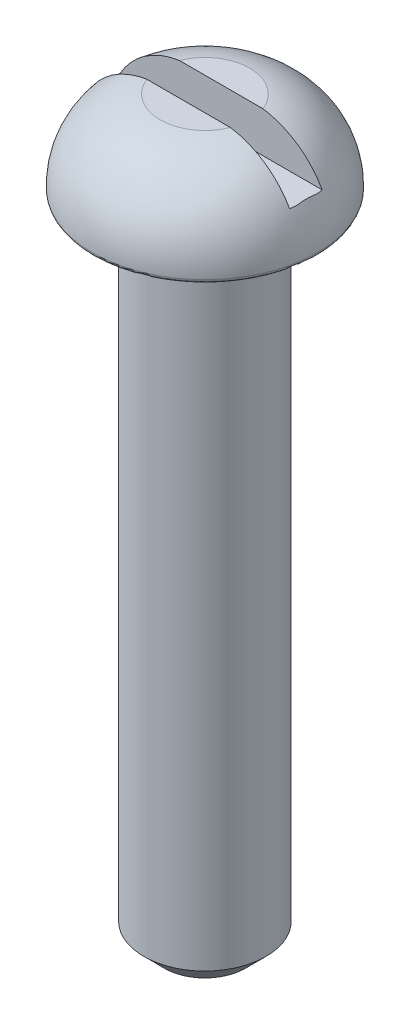
ISO-10303-21;
HEADER;
FILE_DESCRIPTION(('STEP AP214'),'2;1');
FILE_NAME('part.step','',(''),(''),'','','');
FILE_SCHEMA(('AUTOMOTIVE_DESIGN { 1 0 10303 214 1 1 1 1 }'));
ENDSEC;
DATA;
#1=APPLICATION_CONTEXT('core data for automotive mechanical design processes');
#2=APPLICATION_PROTOCOL_DEFINITION('international standard','automotive_design',2000,#1);
#3=PRODUCT_CONTEXT('',#1,'mechanical');
#4=PRODUCT('Part','Part','',(#3));
#5=PRODUCT_RELATED_PRODUCT_CATEGORY('part','',(#4));
#6=PRODUCT_DEFINITION_FORMATION('','',#4);
#7=PRODUCT_DEFINITION_CONTEXT('part definition',#1,'design');
#8=PRODUCT_DEFINITION('design','',#6,#7);
#9=PRODUCT_DEFINITION_SHAPE('','',#8);
#10=(LENGTH_UNIT() NAMED_UNIT(*) SI_UNIT(.MILLI.,.METRE.));
#11=(NAMED_UNIT(*) PLANE_ANGLE_UNIT() SI_UNIT($,.RADIAN.));
#12=(NAMED_UNIT(*) SI_UNIT($,.STERADIAN.) SOLID_ANGLE_UNIT());
#13=UNCERTAINTY_MEASURE_WITH_UNIT(LENGTH_MEASURE(1.E-05),#10,'distance_accuracy_value','');
#14=(GEOMETRIC_REPRESENTATION_CONTEXT(3) GLOBAL_UNCERTAINTY_ASSIGNED_CONTEXT((#13)) GLOBAL_UNIT_ASSIGNED_CONTEXT((#10,
#11,#12)) REPRESENTATION_CONTEXT('',''));
#15=CARTESIAN_POINT('',(0.,0.,0.));
#16=DIRECTION('',(0.,0.,1.));
#17=DIRECTION('',(1.,0.,0.));
#18=AXIS2_PLACEMENT_3D('',#15,#16,#17);
#19=CARTESIAN_POINT('',(0.,18.1,0.));
#20=DIRECTION('',(0.,1.,0.));
#21=DIRECTION('',(0.,0.,1.));
#22=AXIS2_PLACEMENT_3D('',#19,#20,#21);
#23=PLANE('',#22);
#24=DIRECTION('',(-1.,0.,0.));
#25=VECTOR('',#24,1.);
#26=CARTESIAN_POINT('',(-2.5,18.1,-0.4));
#27=LINE('',#26,#25);
#28=CARTESIAN_POINT('',(1.02469507659597,18.1,-0.4));
#29=VERTEX_POINT('',#28);
#30=CARTESIAN_POINT('',(-1.02469507659597,18.1,-0.4));
#31=VERTEX_POINT('',#30);
#32=EDGE_CURVE('E95',#29,#31,#27,.T.);
#33=ORIENTED_EDGE('',*,*,#32,.F.);
#34=CARTESIAN_POINT('',(0.,18.1,0.));
#35=DIRECTION('',(0.,-1.,0.));
#36=DIRECTION('',(0.,0.,-1.));
#37=AXIS2_PLACEMENT_3D('',#34,#35,#36);
#38=CIRCLE('',#37,1.1);
#39=EDGE_CURVE('E101',#31,#29,#38,.T.);
#40=ORIENTED_EDGE('',*,*,#39,.F.);
#41=EDGE_LOOP('',(#33,#40));
#42=FACE_BOUND('',#41,.T.);
#43=ADVANCED_FACE('F29',(#42),#23,.T.);
#44=CARTESIAN_POINT('',(1.,0.,0.));
#45=DIRECTION('',(0.,-1.,0.));
#46=DIRECTION('',(0.,0.,-1.));
#47=AXIS2_PLACEMENT_3D('',#44,#45,#46);
#48=PLANE('',#47);
#49=CARTESIAN_POINT('',(0.,0.,0.));
#50=DIRECTION('',(0.,-1.,0.));
#51=DIRECTION('',(0.,0.,-1.));
#52=AXIS2_PLACEMENT_3D('',#49,#50,#51);
#53=CIRCLE('',#52,1.);
#54=CARTESIAN_POINT('',(0.,0.,-1.));
#55=VERTEX_POINT('',#54);
#56=EDGE_CURVE('E223',#55,#55,#53,.T.);
#57=ORIENTED_EDGE('',*,*,#56,.T.);
#58=EDGE_LOOP('',(#57));
#59=FACE_BOUND('',#58,.T.);
#60=ADVANCED_FACE('F31',(#59),#48,.T.);
#61=DIRECTION('',(1.,0.,0.));
#62=VECTOR('',#61,1.);
#63=CARTESIAN_POINT('',(-2.5,18.1,0.4));
#64=LINE('',#63,#62);
#65=CARTESIAN_POINT('',(-1.02469507659597,18.1,0.4));
#66=VERTEX_POINT('',#65);
#67=CARTESIAN_POINT('',(1.02469507659597,18.1,0.4));
#68=VERTEX_POINT('',#67);
#69=EDGE_CURVE('E87',#66,#68,#64,.T.);
#70=ORIENTED_EDGE('',*,*,#69,.F.);
#71=EDGE_CURVE('E94',#68,#66,#38,.T.);
#72=ORIENTED_EDGE('',*,*,#71,.F.);
#73=EDGE_LOOP('',(#70,#72));
#74=FACE_BOUND('',#73,.T.);
#75=ADVANCED_FACE('F93',(#74),#23,.T.);
#76=CARTESIAN_POINT('',(0.,16.150099776341,0.));
#77=DIRECTION('',(0.,-1.,0.));
#78=DIRECTION('',(0.,0.,-1.));
#79=AXIS2_PLACEMENT_3D('',#76,#77,#78);
#80=DEGENERATE_TOROIDAL_SURFACE('',#79,0.779672442615769,1.97603659537098,.T.);
#81=CARTESIAN_POINT('',(0.,18.0893185526949,0.4));
#82=CARTESIAN_POINT('',(0.0336322301279484,18.0893205716001,0.4));
#83=CARTESIAN_POINT('',(0.0672648143564295,18.0901784468217,0.4));
#84=CARTESIAN_POINT('',(0.134486048973815,18.0932787408374,0.4));
#85=CARTESIAN_POINT('',(0.168074638300507,18.0955223279096,0.4));
#86=CARTESIAN_POINT('',(0.235341692539278,18.100675588183,0.4));
#87=CARTESIAN_POINT('',(0.269019918116885,18.1035880994358,0.4));
#88=CARTESIAN_POINT('',(0.336378018840054,18.1093648088338,0.4));
#89=CARTESIAN_POINT('',(0.370057893639487,18.1122290108159,0.4));
#90=CARTESIAN_POINT('',(0.437877287244912,18.1174111816535,0.4));
#91=CARTESIAN_POINT('',(0.472017389468459,18.1197220409397,0.4));
#92=CARTESIAN_POINT('',(0.540348220697959,18.1233824621022,0.4));
#93=CARTESIAN_POINT('',(0.574538947867759,18.124732058027,0.4));
#94=CARTESIAN_POINT('',(0.677147719963299,18.1269491128557,0.4));
#95=CARTESIAN_POINT('',(0.745623445649574,18.1259868039846,0.4));
#96=CARTESIAN_POINT('',(0.881972396232885,18.1181001103437,0.4));
#97=CARTESIAN_POINT('',(0.949846939653067,18.1112000935624,0.4));
#98=CARTESIAN_POINT('',(1.08464932382839,18.091052747799,0.4));
#99=CARTESIAN_POINT('',(1.1515770535867,18.0778046808679,0.4));
#100=CARTESIAN_POINT('',(1.32743905883569,18.0338998713499,0.4));
#101=CARTESIAN_POINT('',(1.43501246700903,17.9975241731368,0.4));
#102=CARTESIAN_POINT('',(1.64277375092832,17.9071409643015,0.4));
#103=CARTESIAN_POINT('',(1.74294278143891,17.8530902425877,0.4));
#104=CARTESIAN_POINT('',(1.93265776354999,17.7286817859467,0.4));
#105=CARTESIAN_POINT('',(2.02220009208707,17.6583185134356,0.4));
#106=CARTESIAN_POINT('',(2.18779655682164,17.5033275008754,0.4));
#107=CARTESIAN_POINT('',(2.26386325268286,17.4187131882393,0.4));
#108=CARTESIAN_POINT('',(2.39887936251544,17.2395132914902,0.4));
#109=CARTESIAN_POINT('',(2.4581485407167,17.1451684721683,0.4));
#110=CARTESIAN_POINT('',(2.55988756159558,16.9477855070151,0.4));
#111=CARTESIAN_POINT('',(2.60235359515437,16.8447453964566,0.4));
#112=CARTESIAN_POINT('',(2.66896720325158,16.6337422855212,0.4));
#113=CARTESIAN_POINT('',(2.69324730817994,16.5258211017661,0.4));
#114=CARTESIAN_POINT('',(2.72329499940504,16.3074482378214,0.4));
#115=CARTESIAN_POINT('',(2.72906565960174,16.1969969808749,0.4));
#116=CARTESIAN_POINT('',(2.72194370625238,15.9769623688357,0.4));
#117=CARTESIAN_POINT('',(2.70909546504866,15.8673775740258,0.4));
#118=CARTESIAN_POINT('',(2.6651805408064,15.6518857114062,0.4));
#119=CARTESIAN_POINT('',(2.63410816106256,15.5459798045542,0.4));
#120=CARTESIAN_POINT('',(2.55461964830541,15.3408306457122,0.4));
#121=CARTESIAN_POINT('',(2.50619477197843,15.2415907824946,0.4));
#122=CARTESIAN_POINT('',(2.39346155608861,15.052730884082,0.4));
#123=CARTESIAN_POINT('',(2.32917055267637,14.9631005013886,0.4));
#124=CARTESIAN_POINT('',(2.18644835327305,14.7957164743583,0.4));
#125=CARTESIAN_POINT('',(2.10799740164991,14.7179797073024,0.4));
#126=CARTESIAN_POINT('',(1.93891521729073,14.5763707060294,0.4));
#127=CARTESIAN_POINT('',(1.84824228313099,14.5125479889316,0.4));
#128=CARTESIAN_POINT('',(1.70483704950053,14.4284535397504,0.4));
#129=CARTESIAN_POINT('',(1.65548996211767,14.4022428223578,0.4));
#130=CARTESIAN_POINT('',(1.55478898942816,14.3540199909275,0.4));
#131=CARTESIAN_POINT('',(1.50343572310355,14.332006593994,0.4));
#132=CARTESIAN_POINT('',(1.39961052954735,14.2924848989193,0.4));
#133=CARTESIAN_POINT('',(1.34715470355699,14.2749341704783,0.4));
#134=CARTESIAN_POINT('',(1.2409666890078,14.244087442157,0.4));
#135=CARTESIAN_POINT('',(1.18723349557357,14.2307949196762,0.4));
#136=CARTESIAN_POINT('',(1.06403178522894,14.205409251435,0.4));
#137=CARTESIAN_POINT('',(0.994285023188455,14.1946421646372,0.4));
#138=CARTESIAN_POINT('',(0.889221117660135,14.1834683145864,0.4));
#139=CARTESIAN_POINT('',(0.854144078017123,14.1805733737856,0.4));
#140=CARTESIAN_POINT('',(0.783890511350756,14.1763542743213,0.4));
#141=CARTESIAN_POINT('',(0.748713977069496,14.1750302333769,0.4));
#142=CARTESIAN_POINT('',(0.677638959238733,14.1738276664905,0.4));
#143=CARTESIAN_POINT('',(0.641740038461007,14.1739784290901,0.4));
#144=CARTESIAN_POINT('',(0.569980696305394,14.1756063795703,0.4));
#145=CARTESIAN_POINT('',(0.534120269672281,14.1770833545146,0.4));
#146=CARTESIAN_POINT('',(0.462484408653173,14.1810718468225,0.4));
#147=CARTESIAN_POINT('',(0.426708933647391,14.1835826767192,0.4));
#148=CARTESIAN_POINT('',(0.355202454218452,14.1891910628304,0.4));
#149=CARTESIAN_POINT('',(0.319471456309069,14.1922886966696,0.4));
#150=CARTESIAN_POINT('',(0.242092989679392,14.1989153704634,0.4));
#151=CARTESIAN_POINT('',(0.200444216725471,14.202431044494,0.4));
#152=CARTESIAN_POINT('',(0.117048492487825,14.2079387604799,0.4));
#153=CARTESIAN_POINT('',(0.0753016013203199,14.209931570048,0.4));
#154=CARTESIAN_POINT('',(-0.00826329739641611,14.2112825106585,0.4));
#155=CARTESIAN_POINT('',(-0.0500813291633944,14.2106394017257,0.4));
#156=CARTESIAN_POINT('',(-0.133639653626829,14.207103381295,0.4));
#157=CARTESIAN_POINT('',(-0.175379845783751,14.2042084942557,0.4));
#158=CARTESIAN_POINT('',(-0.258750304049306,14.1975943400043,0.4));
#159=CARTESIAN_POINT('',(-0.300380631753085,14.1938757412807,0.4));
#160=CARTESIAN_POINT('',(-0.383666399543725,14.186876174696,0.4));
#161=CARTESIAN_POINT('',(-0.425321824593241,14.1835950450587,0.4));
#162=CARTESIAN_POINT('',(-0.508683231706619,14.1782963358118,0.4));
#163=CARTESIAN_POINT('',(-0.550389134860414,14.1762776249953,0.4));
#164=CARTESIAN_POINT('',(-0.633847536707261,14.1739944667312,0.4));
#165=CARTESIAN_POINT('',(-0.675600033238177,14.1737299410121,0.4));
#166=CARTESIAN_POINT('',(-0.798279554043574,14.1759998570305,0.4));
#167=CARTESIAN_POINT('',(-0.879185473529252,14.1813950893823,0.4));
#168=CARTESIAN_POINT('',(-1.04009545442698,14.2010893630931,0.4));
#169=CARTESIAN_POINT('',(-1.12009731292904,14.2154067359856,0.4));
#170=CARTESIAN_POINT('',(-1.27744036603241,14.2531371767776,0.4));
#171=CARTESIAN_POINT('',(-1.35479443169436,14.2764963080499,0.4));
#172=CARTESIAN_POINT('',(-1.50607354050183,14.3322003727284,0.4));
#173=CARTESIAN_POINT('',(-1.58000406828918,14.3645303092733,0.4));
#174=CARTESIAN_POINT('',(-1.70066637437027,14.4262016445704,0.4));
#175=CARTESIAN_POINT('',(-1.74858977096696,14.4532405563336,0.4));
#176=CARTESIAN_POINT('',(-1.84204738578045,14.5111970567725,0.4));
#177=CARTESIAN_POINT('',(-1.88758126390451,14.5421151954546,0.4));
#178=CARTESIAN_POINT('',(-1.97648927226613,14.6080550455863,0.4));
#179=CARTESIAN_POINT('',(-2.01982815044725,14.6431243634135,0.4));
#180=CARTESIAN_POINT('',(-2.1033724306137,14.7167808584539,0.4));
#181=CARTESIAN_POINT('',(-2.14357835593792,14.7553674457841,0.4));
#182=CARTESIAN_POINT('',(-2.2587607536681,14.8757272034826,0.4));
#183=CARTESIAN_POINT('',(-2.32872619866152,14.9624156004797,0.4));
#184=CARTESIAN_POINT('',(-2.45273016359911,15.1459448693482,0.4));
#185=CARTESIAN_POINT('',(-2.50683160667459,15.2427435078881,0.4));
#186=CARTESIAN_POINT('',(-2.59789639376453,15.4439330360896,0.4));
#187=CARTESIAN_POINT('',(-2.63488542916095,15.5483122703699,0.4));
#188=CARTESIAN_POINT('',(-2.69078481684574,15.7619271363491,0.4));
#189=CARTESIAN_POINT('',(-2.70967494073832,15.8711680594469,0.4));
#190=CARTESIAN_POINT('',(-2.72872049994938,16.0908395059785,0.4));
#191=CARTESIAN_POINT('',(-2.72894896278393,16.2012637009853,0.4));
#192=CARTESIAN_POINT('',(-2.71085046679963,16.4205454982235,0.4));
#193=CARTESIAN_POINT('',(-2.69252940318254,16.5294035870293,0.4));
#194=CARTESIAN_POINT('',(-2.63788660496967,16.7424370075218,0.4));
#195=CARTESIAN_POINT('',(-2.60157509032425,16.846614961278,0.4));
#196=CARTESIAN_POINT('',(-2.51199794489184,17.0474252587672,0.4));
#197=CARTESIAN_POINT('',(-2.45872965131865,17.1440564144286,0.4));
#198=CARTESIAN_POINT('',(-2.33667666099476,17.3271964801786,0.4));
#199=CARTESIAN_POINT('',(-2.26786608902605,17.4136881407663,0.4));
#200=CARTESIAN_POINT('',(-2.11678830197825,17.5739363806434,0.4));
#201=CARTESIAN_POINT('',(-2.03452512343711,17.6476967664262,0.4));
#202=CARTESIAN_POINT('',(-1.85845680132219,17.7808768253944,0.4));
#203=CARTESIAN_POINT('',(-1.76459390280108,17.8402199873494,0.4));
#204=CARTESIAN_POINT('',(-1.56825068819713,17.9426259986815,0.4));
#205=CARTESIAN_POINT('',(-1.46576450258906,17.9856776476967,0.4));
#206=CARTESIAN_POINT('',(-1.30705768686075,18.0376774159838,0.4));
#207=CARTESIAN_POINT('',(-1.25283407094735,18.0529905421259,0.4));
#208=CARTESIAN_POINT('',(-1.14331010617454,18.0791983631637,0.4));
#209=CARTESIAN_POINT('',(-1.08800961915704,18.0900924871533,0.4));
#210=CARTESIAN_POINT('',(-0.97681174003821,18.1075176170994,0.4));
#211=CARTESIAN_POINT('',(-0.920915266039495,18.1140545600937,0.4));
#212=CARTESIAN_POINT('',(-0.808825447819162,18.1230046821046,0.4));
#213=CARTESIAN_POINT('',(-0.752632245417545,18.1254196787798,0.4));
#214=CARTESIAN_POINT('',(-0.638202420490206,18.1265954454027,0.4));
#215=CARTESIAN_POINT('',(-0.579964874932336,18.1252218904068,0.4));
#216=CARTESIAN_POINT('',(-0.46360277126232,18.1194855430093,0.4));
#217=CARTESIAN_POINT('',(-0.405478390225978,18.115119687082,0.4));
#218=CARTESIAN_POINT('',(-0.318466264025514,18.1078602606046,0.4));
#219=CARTESIAN_POINT('',(-0.289542668712592,18.1053271525568,0.4));
#220=CARTESIAN_POINT('',(-0.231677824652607,18.1004358120315,0.4));
#221=CARTESIAN_POINT('',(-0.202736575195269,18.098077587132,0.4));
#222=CARTESIAN_POINT('',(-0.144850436771976,18.0940084600175,0.4));
#223=CARTESIAN_POINT('',(-0.115905623626867,18.0922965556835,0.4));
#224=CARTESIAN_POINT('',(-0.0579739548392592,18.0899508415462,0.4));
#225=CARTESIAN_POINT('',(-0.0289871089406161,18.0893168126311,0.4));
#226=CARTESIAN_POINT('',(0.,18.0893185526949,0.4));
#227=B_SPLINE_CURVE_WITH_KNOTS('',3,(#81,#82,#83,#84,#85,#86,#87,#88,#89,#90,#91,#92,#93,#94,
#95,#96,#97,#98,#99,#100,#101,#102,#103,#104,#105,#106,#107,#108,#109,#110,#111,#112,#113,#114,
#115,#116,#117,#118,#119,#120,#121,#122,#123,#124,#125,#126,#127,#128,#129,#130,#131,#132,#133,
#134,#135,#136,#137,#138,#139,#140,#141,#142,#143,#144,#145,#146,#147,#148,#149,#150,#151,#152,
#153,#154,#155,#156,#157,#158,#159,#160,#161,#162,#163,#164,#165,#166,#167,#168,#169,#170,#171,
#172,#173,#174,#175,#176,#177,#178,#179,#180,#181,#182,#183,#184,#185,#186,#187,#188,#189,#190,
#191,#192,#193,#194,#195,#196,#197,#198,#199,#200,#201,#202,#203,#204,#205,#206,#207,#208,#209,
#210,#211,#212,#213,#214,#215,#216,#217,#218,#219,#220,#221,#222,#223,#224,#225,#226),
.UNSPECIFIED.,.T.,.F.,(4,2,2,2,2,2,2,2,2,2,2,2,2,2,2,2,2,2,2,2,2,2,2,2,2,2,2,2,2,2,2,2,2,2,2,2,
2,2,2,2,2,2,2,2,2,2,2,2,2,2,2,2,2,2,2,2,2,2,2,2,2,2,2,2,2,2,2,2,2,2,2,2,4),(0.,
0.100890023684147,0.201865222941381,0.303277014523181,0.404680713008293,0.507324699032976,
0.609965049175349,0.815182329830902,1.01956140617602,1.2239642469793,1.56297001300182,
1.9028108396941,2.24276720072985,2.58240502666488,2.91506020623249,3.24779075253565,
3.57807227226821,3.9082989386574,4.23773990589673,4.56728390841001,4.89699419059369,
5.22634579707033,5.55616050998684,5.88713046661355,6.05459853805704,6.2220153411517,
6.3877752381392,6.55367015739327,6.76501012148147,6.87057116918617,6.97614012686719,
7.08380979826554,7.19146218533488,7.29904310373741,7.40663826332752,7.5320256774002,
7.65734984711898,7.78273297795791,7.90822623481,8.0336180175237,8.15896330091045,
8.28419610546775,8.40942332211293,8.65221314412585,8.89550345712306,9.13736430175855,
9.37882322878408,9.54372519059975,9.70865055909831,9.87569425907166,10.0427099954236,
10.3751757055229,10.7063043070527,11.0369341487599,11.3679330920179,11.6976366954213,
12.0272355490162,12.3566473796014,12.6861109644934,13.0161271461232,13.3460444854371,
13.6776761947944,14.0095354874337,14.1784156846561,14.347317693148,14.5159890849236,
14.6845860782747,14.8592368371136,15.0340666714877,15.1211717845947,15.208280669984,
15.2952539330297,15.3822095139242),.UNSPECIFIED.);
#228=CARTESIAN_POINT('',(-2.48037267208639,17.1,0.4));
#229=VERTEX_POINT('',#228);
#230=EDGE_CURVE('E11',#229,#66,#227,.T.);
#231=ORIENTED_EDGE('',*,*,#230,.F.);
#232=CARTESIAN_POINT('',(0.,17.1,0.));
#233=DIRECTION('',(0.,1.,0.));
#234=DIRECTION('',(0.,0.,1.));
#235=AXIS2_PLACEMENT_3D('',#232,#233,#234);
#236=CIRCLE('',#235,2.51241887280624);
#237=CARTESIAN_POINT('',(-2.5,17.1,0.249496678200301));
#238=VERTEX_POINT('',#237);
#239=EDGE_CURVE('E42',#229,#238,#236,.F.);
#240=ORIENTED_EDGE('',*,*,#239,.T.);
#241=CARTESIAN_POINT('',(-2.5,17.1223105156098,0.));
#242=CARTESIAN_POINT('',(-2.5,17.1223101461313,0.0712306788425633));
#243=CARTESIAN_POINT('',(-2.5,17.1169240888941,0.142558865114006));
#244=CARTESIAN_POINT('',(-2.5,17.0952483334499,0.283701712225144));
#245=CARTESIAN_POINT('',(-2.5,17.0789301875964,0.353511932388623));
#246=CARTESIAN_POINT('',(-2.5,17.0350344874374,0.489880588433874));
#247=CARTESIAN_POINT('',(-2.5,17.0074101065493,0.556424195769014));
#248=CARTESIAN_POINT('',(-2.5,16.9407369512236,0.683471035223085));
#249=CARTESIAN_POINT('',(-2.5,16.9017106646115,0.743985845778087));
#250=CARTESIAN_POINT('',(-2.5,16.8227307863145,0.843275760575025));
#251=CARTESIAN_POINT('',(-2.5,16.7850407746805,0.883854319520754));
#252=CARTESIAN_POINT('',(-2.5,16.7034539698896,0.958249349802382));
#253=CARTESIAN_POINT('',(-2.5,16.6595595433445,0.992068387670537));
#254=CARTESIAN_POINT('',(-2.5,16.566145410668,1.05156470459039));
#255=CARTESIAN_POINT('',(-2.5,16.5165933380393,1.07719158850153));
#256=CARTESIAN_POINT('',(-2.5,16.4135136440282,1.11857305743128));
#257=CARTESIAN_POINT('',(-2.5,16.3599883621531,1.13433340129616));
#258=CARTESIAN_POINT('',(-2.5,16.2568447126333,1.15387563353978));
#259=CARTESIAN_POINT('',(-2.5,16.2074364619562,1.15877596536218));
#260=CARTESIAN_POINT('',(-2.5,16.1085452840721,1.15971101314125));
#261=CARTESIAN_POINT('',(-2.5,16.0590623920535,1.15574907177317));
#262=CARTESIAN_POINT('',(-2.5,15.9641185155025,1.13961207805656));
#263=CARTESIAN_POINT('',(-2.5,15.9185820862839,1.12787399445516));
#264=CARTESIAN_POINT('',(-2.5,15.8300259482908,1.09717394472953));
#265=CARTESIAN_POINT('',(-2.5,15.7870063765887,1.07821158558015));
#266=CARTESIAN_POINT('',(-2.5,15.702974014653,1.03306389528727));
#267=CARTESIAN_POINT('',(-2.5,15.6620868851607,1.00664580851613));
#268=CARTESIAN_POINT('',(-2.5,15.5847867197529,0.947939477777542));
#269=CARTESIAN_POINT('',(-2.5,15.5483752369431,0.915649205671528));
#270=CARTESIAN_POINT('',(-2.5,15.4768841506192,0.842566073313486));
#271=CARTESIAN_POINT('',(-2.5,15.4423568726614,0.801234383081301));
#272=CARTESIAN_POINT('',(-2.5,15.3796399023452,0.714029036243395));
#273=CARTESIAN_POINT('',(-2.5,15.3514534775994,0.668153055300622));
#274=CARTESIAN_POINT('',(-2.5,15.2976264083185,0.56570561158647));
#275=CARTESIAN_POINT('',(-2.5,15.2730492589374,0.508575952252563));
#276=CARTESIAN_POINT('',(-2.5,15.2323220574934,0.391397341288988));
#277=CARTESIAN_POINT('',(-2.5,15.2161769208644,0.331346709126051));
#278=CARTESIAN_POINT('',(-2.5,15.1902112979717,0.199724484838881));
#279=CARTESIAN_POINT('',(-2.5,15.1818421784008,0.12786457102089));
#280=CARTESIAN_POINT('',(-2.5,15.1761381430047,-0.0163393775210903));
#281=CARTESIAN_POINT('',(-2.5,15.1788140197515,-0.088683816768408));
#282=CARTESIAN_POINT('',(-2.5,15.1960418651365,-0.238852141273033));
#283=CARTESIAN_POINT('',(-2.5,15.2116819092154,-0.316555155132484));
#284=CARTESIAN_POINT('',(-2.5,15.2565453792341,-0.467928327990436));
#285=CARTESIAN_POINT('',(-2.5,15.2857522182913,-0.54160328912711));
#286=CARTESIAN_POINT('',(-2.5,15.3496625973163,-0.665743650160983));
#287=CARTESIAN_POINT('',(-2.5,15.3815645966084,-0.717654202163191));
#288=CARTESIAN_POINT('',(-2.5,15.4534783502318,-0.81556073045013));
#289=CARTESIAN_POINT('',(-2.5,15.4934864005324,-0.861559392517828));
#290=CARTESIAN_POINT('',(-2.5,15.5814846868964,-0.946000066696015));
#291=CARTESIAN_POINT('',(-2.5,15.6295346361276,-0.98438046631621));
#292=CARTESIAN_POINT('',(-2.5,15.7322573046179,-1.05096309856745));
#293=CARTESIAN_POINT('',(-2.5,15.7869239497771,-1.07917457297966));
#294=CARTESIAN_POINT('',(-2.5,15.8930703954801,-1.12047369115394));
#295=CARTESIAN_POINT('',(-2.5,15.9439487014708,-1.1351112921511));
#296=CARTESIAN_POINT('',(-2.5,16.0475396282018,-1.15459744549457));
#297=CARTESIAN_POINT('',(-2.5,16.1002509150112,-1.1594529710136));
#298=CARTESIAN_POINT('',(-2.5,16.2004596648121,-1.15911656356735));
#299=CARTESIAN_POINT('',(-2.5,16.2479629496431,-1.1548606781451));
#300=CARTESIAN_POINT('',(-2.5,16.3415555906014,-1.13837987259775));
#301=CARTESIAN_POINT('',(-2.5,16.3876451456364,-1.12615607896912));
#302=CARTESIAN_POINT('',(-2.5,16.4769476336827,-1.09439743039534));
#303=CARTESIAN_POINT('',(-2.5,16.520174022329,-1.07490012929803));
#304=CARTESIAN_POINT('',(-2.5,16.6030503419432,-1.02941245372522));
#305=CARTESIAN_POINT('',(-2.5,16.6426993791683,-1.00342046273776));
#306=CARTESIAN_POINT('',(-2.5,16.7205513651631,-0.943733525554364));
#307=CARTESIAN_POINT('',(-2.5,16.7584219937318,-0.909606632222672));
#308=CARTESIAN_POINT('',(-2.5,16.8287175103071,-0.836166720546381));
#309=CARTESIAN_POINT('',(-2.5,16.8611406259582,-0.79685202174152));
#310=CARTESIAN_POINT('',(-2.5,16.9242870729129,-0.708603935542906));
#311=CARTESIAN_POINT('',(-2.5,16.954194677086,-0.659088099147598));
#312=CARTESIAN_POINT('',(-2.5,17.0066444999432,-0.556273142143709));
#313=CARTESIAN_POINT('',(-2.5,17.0291784094696,-0.502969835297219));
#314=CARTESIAN_POINT('',(-2.5,17.0700907472227,-0.384754626029004));
#315=CARTESIAN_POINT('',(-2.5,17.0871515513999,-0.319388131208309));
#316=CARTESIAN_POINT('',(-2.5,17.1115049400841,-0.186964805934882));
#317=CARTESIAN_POINT('',(-2.5,17.1188140967822,-0.119911041019672));
#318=CARTESIAN_POINT('',(-2.5,17.1219821685527,-0.0351795517586189));
#319=CARTESIAN_POINT('',(-2.5,17.1223106068647,-0.0175927498795493));
#320=CARTESIAN_POINT('',(-2.5,17.1223105156098,0.));
#321=B_SPLINE_CURVE_WITH_KNOTS('',3,(#241,#242,#243,#244,#245,#246,#247,#248,#249,#250,#251,
#252,#253,#254,#255,#256,#257,#258,#259,#260,#261,#262,#263,#264,#265,#266,#267,#268,#269,#270,
#271,#272,#273,#274,#275,#276,#277,#278,#279,#280,#281,#282,#283,#284,#285,#286,#287,#288,#289,
#290,#291,#292,#293,#294,#295,#296,#297,#298,#299,#300,#301,#302,#303,#304,#305,#306,#307,#308,
#309,#310,#311,#312,#313,#314,#315,#316,#317,#318,#319,#320),.UNSPECIFIED.,.T.,.F.,(4,2,2,2,2,2,
2,2,2,2,2,2,2,2,2,2,2,2,2,2,2,2,2,2,2,2,2,2,2,2,2,2,2,2,2,2,2,2,2,4),(0.,0.213654058428576,
0.42786626146703,0.64297478384495,0.857661882047719,1.02313256849238,1.18854030728178,
1.3549468214316,1.52125611759126,1.6694369131548,1.81756182725976,1.95799843379395,
2.09844268164834,2.24387837543208,2.38936439560361,2.5503044851353,2.71132732241043,
2.89719032712375,3.08316155989774,3.29930936619595,3.51566843039355,3.75227711459239,
3.98859727727575,4.17066050848425,4.35264073342775,4.5360375900651,4.71926734814892,
4.87720820490711,5.0350364333044,5.17743169042944,5.31980682019251,5.46145680385797,
5.6031420790279,5.7554697940916,5.90784697360661,6.08072712684901,6.25380142712085,
6.4557081190197,6.65727124675773,6.71004011646052),.UNSPECIFIED.);
#322=CARTESIAN_POINT('',(-2.5,17.1,-0.249496678200301));
#323=VERTEX_POINT('',#322);
#324=EDGE_CURVE('E33',#323,#238,#321,.T.);
#325=ORIENTED_EDGE('',*,*,#324,.F.);
#326=CARTESIAN_POINT('',(-2.48037267208639,17.1,-0.4));
#327=VERTEX_POINT('',#326);
#328=EDGE_CURVE('E202',#323,#327,#236,.F.);
#329=ORIENTED_EDGE('',*,*,#328,.T.);
#330=CARTESIAN_POINT('',(0.,18.0893185526949,-0.4));
#331=CARTESIAN_POINT('',(-0.0336322301279489,18.0893205716001,-0.4));
#332=CARTESIAN_POINT('',(-0.06726481435643,18.0901784468217,-0.4));
#333=CARTESIAN_POINT('',(-0.134486048973815,18.0932787408374,-0.4));
#334=CARTESIAN_POINT('',(-0.168074638300508,18.0955223279096,-0.4));
#335=CARTESIAN_POINT('',(-0.235341692539279,18.100675588183,-0.4));
#336=CARTESIAN_POINT('',(-0.269019918116885,18.1035880994358,-0.4));
#337=CARTESIAN_POINT('',(-0.336378018840055,18.1093648088338,-0.4));
#338=CARTESIAN_POINT('',(-0.370057893639487,18.1122290108159,-0.4));
#339=CARTESIAN_POINT('',(-0.437877287244912,18.1174111816535,-0.4));
#340=CARTESIAN_POINT('',(-0.472017389468459,18.1197220409397,-0.4));
#341=CARTESIAN_POINT('',(-0.540348220697959,18.1233824621022,-0.4));
#342=CARTESIAN_POINT('',(-0.57453894786776,18.124732058027,-0.4));
#343=CARTESIAN_POINT('',(-0.6771477199633,18.1269491128557,-0.4));
#344=CARTESIAN_POINT('',(-0.745623445649575,18.1259868039846,-0.4));
#345=CARTESIAN_POINT('',(-0.881972396232887,18.1181001103437,-0.4));
#346=CARTESIAN_POINT('',(-0.949846939653069,18.1112000935624,-0.4));
#347=CARTESIAN_POINT('',(-1.08464932382839,18.091052747799,-0.4));
#348=CARTESIAN_POINT('',(-1.1515770535867,18.0778046808679,-0.4));
#349=CARTESIAN_POINT('',(-1.3274390588357,18.0338998713499,-0.4));
#350=CARTESIAN_POINT('',(-1.43501246700903,17.9975241731368,-0.4));
#351=CARTESIAN_POINT('',(-1.64277375092832,17.9071409643015,-0.4));
#352=CARTESIAN_POINT('',(-1.74294278143891,17.8530902425877,-0.4));
#353=CARTESIAN_POINT('',(-1.93265776354999,17.7286817859467,-0.4));
#354=CARTESIAN_POINT('',(-2.02220009208707,17.6583185134356,-0.4));
#355=CARTESIAN_POINT('',(-2.18779655682164,17.5033275008754,-0.4));
#356=CARTESIAN_POINT('',(-2.26386325268286,17.4187131882393,-0.4));
#357=CARTESIAN_POINT('',(-2.39887936251544,17.2395132914902,-0.4));
#358=CARTESIAN_POINT('',(-2.4581485407167,17.1451684721682,-0.4));
#359=CARTESIAN_POINT('',(-2.55988756159559,16.9477855070151,-0.4));
#360=CARTESIAN_POINT('',(-2.60235359515437,16.8447453964566,-0.4));
#361=CARTESIAN_POINT('',(-2.66896720325158,16.6337422855212,-0.4));
#362=CARTESIAN_POINT('',(-2.69324730817994,16.5258211017661,-0.4));
#363=CARTESIAN_POINT('',(-2.72329499940504,16.3074482378214,-0.4));
#364=CARTESIAN_POINT('',(-2.72906565960174,16.1969969808749,-0.4));
#365=CARTESIAN_POINT('',(-2.72194370625238,15.9769623688357,-0.4));
#366=CARTESIAN_POINT('',(-2.70909546504866,15.8673775740258,-0.4));
#367=CARTESIAN_POINT('',(-2.6651805408064,15.6518857114062,-0.4));
#368=CARTESIAN_POINT('',(-2.63410816106256,15.5459798045542,-0.4));
#369=CARTESIAN_POINT('',(-2.55461964830541,15.3408306457122,-0.4));
#370=CARTESIAN_POINT('',(-2.50619477197843,15.2415907824946,-0.4));
#371=CARTESIAN_POINT('',(-2.39346155608861,15.052730884082,-0.4));
#372=CARTESIAN_POINT('',(-2.32917055267637,14.9631005013886,-0.4));
#373=CARTESIAN_POINT('',(-2.18644835327304,14.7957164743583,-0.4));
#374=CARTESIAN_POINT('',(-2.10799740164991,14.7179797073024,-0.4));
#375=CARTESIAN_POINT('',(-1.93891521729073,14.5763707060294,-0.4));
#376=CARTESIAN_POINT('',(-1.84824228313099,14.5125479889316,-0.4));
#377=CARTESIAN_POINT('',(-1.70483704950053,14.4284535397504,-0.4));
#378=CARTESIAN_POINT('',(-1.65548996211766,14.4022428223578,-0.4));
#379=CARTESIAN_POINT('',(-1.55478898942815,14.3540199909275,-0.4));
#380=CARTESIAN_POINT('',(-1.50343572310355,14.332006593994,-0.4));
#381=CARTESIAN_POINT('',(-1.39961052954735,14.2924848989193,-0.4));
#382=CARTESIAN_POINT('',(-1.34715470355699,14.2749341704783,-0.4));
#383=CARTESIAN_POINT('',(-1.24096668900779,14.244087442157,-0.4));
#384=CARTESIAN_POINT('',(-1.18723349557357,14.2307949196762,-0.4));
#385=CARTESIAN_POINT('',(-1.06403178522893,14.205409251435,-0.4));
#386=CARTESIAN_POINT('',(-0.994285023188452,14.1946421646372,-0.4));
#387=CARTESIAN_POINT('',(-0.889221117660131,14.1834683145864,-0.4));
#388=CARTESIAN_POINT('',(-0.854144078017119,14.1805733737856,-0.4));
#389=CARTESIAN_POINT('',(-0.783890511350752,14.1763542743213,-0.4));
#390=CARTESIAN_POINT('',(-0.748713977069491,14.1750302333769,-0.4));
#391=CARTESIAN_POINT('',(-0.677638959238728,14.1738276664905,-0.4));
#392=CARTESIAN_POINT('',(-0.641740038461001,14.1739784290901,-0.4));
#393=CARTESIAN_POINT('',(-0.569980696305388,14.1756063795703,-0.4));
#394=CARTESIAN_POINT('',(-0.534120269672275,14.1770833545146,-0.4));
#395=CARTESIAN_POINT('',(-0.462484408653168,14.1810718468225,-0.4));
#396=CARTESIAN_POINT('',(-0.426708933647387,14.1835826767192,-0.4));
#397=CARTESIAN_POINT('',(-0.355202454218447,14.1891910628304,-0.4));
#398=CARTESIAN_POINT('',(-0.319471456309063,14.1922886966696,-0.4));
#399=CARTESIAN_POINT('',(-0.242092989679386,14.1989153704634,-0.4));
#400=CARTESIAN_POINT('',(-0.200444216725465,14.202431044494,-0.4));
#401=CARTESIAN_POINT('',(-0.117048492487818,14.2079387604799,-0.4));
#402=CARTESIAN_POINT('',(-0.0753016013203134,14.209931570048,-0.4));
#403=CARTESIAN_POINT('',(0.00826329739642322,14.2112825106585,-0.4));
#404=CARTESIAN_POINT('',(0.0500813291634017,14.2106394017256,-0.4));
#405=CARTESIAN_POINT('',(0.133639653626837,14.207103381295,-0.4));
#406=CARTESIAN_POINT('',(0.175379845783759,14.2042084942557,-0.4));
#407=CARTESIAN_POINT('',(0.258750304049315,14.1975943400043,-0.4));
#408=CARTESIAN_POINT('',(0.300380631753094,14.1938757412807,-0.4));
#409=CARTESIAN_POINT('',(0.383666399543735,14.186876174696,-0.4));
#410=CARTESIAN_POINT('',(0.425321824593252,14.1835950450587,-0.4));
#411=CARTESIAN_POINT('',(0.50868323170663,14.1782963358118,-0.4));
#412=CARTESIAN_POINT('',(0.550389134860426,14.1762776249953,-0.4));
#413=CARTESIAN_POINT('',(0.633847536707275,14.1739944667312,-0.4));
#414=CARTESIAN_POINT('',(0.675600033238191,14.1737299410121,-0.4));
#415=CARTESIAN_POINT('',(0.798279554043589,14.1759998570305,-0.4));
#416=CARTESIAN_POINT('',(0.879185473529268,14.1813950893823,-0.4));
#417=CARTESIAN_POINT('',(1.040095454427,14.2010893630931,-0.4));
#418=CARTESIAN_POINT('',(1.12009731292905,14.2154067359856,-0.4));
#419=CARTESIAN_POINT('',(1.27744036603243,14.2531371767776,-0.4));
#420=CARTESIAN_POINT('',(1.35479443169438,14.2764963080499,-0.4));
#421=CARTESIAN_POINT('',(1.50607354050185,14.3322003727284,-0.4));
#422=CARTESIAN_POINT('',(1.5800040682892,14.3645303092733,-0.4));
#423=CARTESIAN_POINT('',(1.70066637437029,14.4262016445704,-0.4));
#424=CARTESIAN_POINT('',(1.74858977096697,14.4532405563336,-0.4));
#425=CARTESIAN_POINT('',(1.84204738578047,14.5111970567725,-0.4));
#426=CARTESIAN_POINT('',(1.88758126390453,14.5421151954546,-0.400000000000001));
#427=CARTESIAN_POINT('',(1.97648927226614,14.6080550455863,-0.400000000000001));
#428=CARTESIAN_POINT('',(2.01982815044726,14.6431243634135,-0.400000000000001));
#429=CARTESIAN_POINT('',(2.10337243061371,14.7167808584539,-0.400000000000001));
#430=CARTESIAN_POINT('',(2.14357835593793,14.7553674457841,-0.400000000000001));
#431=CARTESIAN_POINT('',(2.25876075366811,14.8757272034826,-0.400000000000001));
#432=CARTESIAN_POINT('',(2.32872619866154,14.9624156004797,-0.400000000000001));
#433=CARTESIAN_POINT('',(2.45273016359912,15.1459448693482,-0.400000000000001));
#434=CARTESIAN_POINT('',(2.5068316066746,15.2427435078881,-0.400000000000001));
#435=CARTESIAN_POINT('',(2.59789639376454,15.4439330360897,-0.400000000000001));
#436=CARTESIAN_POINT('',(2.63488542916096,15.54831227037,-0.400000000000001));
#437=CARTESIAN_POINT('',(2.69078481684575,15.7619271363491,-0.400000000000001));
#438=CARTESIAN_POINT('',(2.70967494073832,15.8711680594469,-0.400000000000001));
#439=CARTESIAN_POINT('',(2.72872049994938,16.0908395059785,-0.400000000000001));
#440=CARTESIAN_POINT('',(2.72894896278392,16.2012637009853,-0.400000000000001));
#441=CARTESIAN_POINT('',(2.71085046679963,16.4205454982235,-0.400000000000001));
#442=CARTESIAN_POINT('',(2.69252940318254,16.5294035870293,-0.400000000000001));
#443=CARTESIAN_POINT('',(2.63788660496966,16.7424370075218,-0.400000000000001));
#444=CARTESIAN_POINT('',(2.60157509032424,16.846614961278,-0.400000000000001));
#445=CARTESIAN_POINT('',(2.51199794489183,17.0474252587673,-0.400000000000001));
#446=CARTESIAN_POINT('',(2.45872965131864,17.1440564144286,-0.400000000000001));
#447=CARTESIAN_POINT('',(2.33667666099475,17.3271964801786,-0.400000000000001));
#448=CARTESIAN_POINT('',(2.26786608902603,17.4136881407664,-0.400000000000001));
#449=CARTESIAN_POINT('',(2.11678830197824,17.5739363806434,-0.400000000000001));
#450=CARTESIAN_POINT('',(2.0345251234371,17.6476967664262,-0.400000000000001));
#451=CARTESIAN_POINT('',(1.85845680132218,17.7808768253944,-0.400000000000001));
#452=CARTESIAN_POINT('',(1.76459390280106,17.8402199873494,-0.4));
#453=CARTESIAN_POINT('',(1.56825068819712,17.9426259986815,-0.4));
#454=CARTESIAN_POINT('',(1.46576450258904,17.9856776476967,-0.4));
#455=CARTESIAN_POINT('',(1.30705768686073,18.0376774159838,-0.4));
#456=CARTESIAN_POINT('',(1.25283407094733,18.0529905421259,-0.4));
#457=CARTESIAN_POINT('',(1.14331010617452,18.0791983631637,-0.4));
#458=CARTESIAN_POINT('',(1.08800961915702,18.0900924871533,-0.4));
#459=CARTESIAN_POINT('',(0.976811740038189,18.1075176170994,-0.4));
#460=CARTESIAN_POINT('',(0.920915266039473,18.1140545600937,-0.4));
#461=CARTESIAN_POINT('',(0.808825447819139,18.1230046821046,-0.4));
#462=CARTESIAN_POINT('',(0.752632245417523,18.1254196787798,-0.4));
#463=CARTESIAN_POINT('',(0.638202420490185,18.1265954454027,-0.4));
#464=CARTESIAN_POINT('',(0.579964874932318,18.1252218904068,-0.4));
#465=CARTESIAN_POINT('',(0.463602771262305,18.1194855430093,-0.4));
#466=CARTESIAN_POINT('',(0.405478390225964,18.115119687082,-0.4));
#467=CARTESIAN_POINT('',(0.318466264025502,18.1078602606046,-0.4));
#468=CARTESIAN_POINT('',(0.289542668712581,18.1053271525568,-0.4));
#469=CARTESIAN_POINT('',(0.231677824652598,18.1004358120315,-0.4));
#470=CARTESIAN_POINT('',(0.202736575195262,18.098077587132,-0.4));
#471=CARTESIAN_POINT('',(0.144850436771971,18.0940084600175,-0.4));
#472=CARTESIAN_POINT('',(0.115905623626863,18.0922965556835,-0.4));
#473=CARTESIAN_POINT('',(0.0579739548392576,18.0899508415462,-0.4));
#474=CARTESIAN_POINT('',(0.0289871089406151,18.0893168126311,-0.4));
#475=CARTESIAN_POINT('',(0.,18.0893185526949,-0.4));
#476=B_SPLINE_CURVE_WITH_KNOTS('',3,(#330,#331,#332,#333,#334,#335,#336,#337,#338,#339,#340,
#341,#342,#343,#344,#345,#346,#347,#348,#349,#350,#351,#352,#353,#354,#355,#356,#357,#358,#359,
#360,#361,#362,#363,#364,#365,#366,#367,#368,#369,#370,#371,#372,#373,#374,#375,#376,#377,#378,
#379,#380,#381,#382,#383,#384,#385,#386,#387,#388,#389,#390,#391,#392,#393,#394,#395,#396,#397,
#398,#399,#400,#401,#402,#403,#404,#405,#406,#407,#408,#409,#410,#411,#412,#413,#414,#415,#416,
#417,#418,#419,#420,#421,#422,#423,#424,#425,#426,#427,#428,#429,#430,#431,#432,#433,#434,#435,
#436,#437,#438,#439,#440,#441,#442,#443,#444,#445,#446,#447,#448,#449,#450,#451,#452,#453,#454,
#455,#456,#457,#458,#459,#460,#461,#462,#463,#464,#465,#466,#467,#468,#469,#470,#471,#472,#473,
#474,#475),.UNSPECIFIED.,.T.,.F.,(4,2,2,2,2,2,2,2,2,2,2,2,2,2,2,2,2,2,2,2,2,2,2,2,2,2,2,2,2,2,2,
2,2,2,2,2,2,2,2,2,2,2,2,2,2,2,2,2,2,2,2,2,2,2,2,2,2,2,2,2,2,2,2,2,2,2,2,2,2,2,2,2,4),(0.,
0.100890023684148,0.201865222941381,0.303277014523182,0.404680713008293,0.507324699032976,
0.60996504917535,0.815182329830902,1.01956140617603,1.22396424697931,1.56297001300182,
1.9028108396941,2.24276720072985,2.58240502666489,2.91506020623249,3.24779075253565,
3.57807227226822,3.9082989386574,4.23773990589673,4.56728390841001,4.89699419059369,
5.22634579707033,5.55616050998685,5.88713046661355,6.05459853805704,6.2220153411517,
6.3877752381392,6.55367015739327,6.76501012148147,6.87057116918617,6.97614012686719,
7.08380979826554,7.19146218533489,7.29904310373741,7.40663826332752,7.53202567740021,
7.65734984711899,7.78273297795791,7.90822623481001,8.03361801752371,8.15896330091046,
8.28419610546776,8.40942332211294,8.65221314412587,8.89550345712308,9.13736430175856,
9.3788232287841,9.54372519059977,9.70865055909832,9.87569425907168,10.0427099954236,
10.3751757055229,10.7063043070528,11.0369341487599,11.367933092018,11.6976366954213,
12.0272355490162,12.3566473796014,12.6861109644935,13.0161271461232,13.3460444854371,
13.6776761947944,14.0095354874337,14.1784156846561,14.3473176931481,14.5159890849236,
14.6845860782747,14.8592368371136,15.0340666714877,15.1211717845947,15.208280669984,
15.2952539330296,15.3822095139242),.UNSPECIFIED.);
#477=EDGE_CURVE('E203',#31,#327,#476,.T.);
#478=ORIENTED_EDGE('',*,*,#477,.F.);
#479=ORIENTED_EDGE('',*,*,#39,.T.);
#480=CARTESIAN_POINT('',(2.48037267208639,17.1,-0.400000000000001));
#481=VERTEX_POINT('',#480);
#482=EDGE_CURVE('E199',#481,#29,#476,.T.);
#483=ORIENTED_EDGE('',*,*,#482,.F.);
#484=CARTESIAN_POINT('',(2.5,17.1,-0.249496678200308));
#485=VERTEX_POINT('',#484);
#486=EDGE_CURVE('E114',#481,#485,#236,.F.);
#487=ORIENTED_EDGE('',*,*,#486,.T.);
#488=CARTESIAN_POINT('',(2.5,17.1223105156098,0.));
#489=CARTESIAN_POINT('',(2.5,17.1223101461313,-0.0712306788425639));
#490=CARTESIAN_POINT('',(2.5,17.1169240888941,-0.142558865114006));
#491=CARTESIAN_POINT('',(2.5,17.0952483334499,-0.283701712225145));
#492=CARTESIAN_POINT('',(2.5,17.0789301875964,-0.353511932388625));
#493=CARTESIAN_POINT('',(2.5,17.0350344874374,-0.489880588433877));
#494=CARTESIAN_POINT('',(2.5,17.0074101065493,-0.556424195769019));
#495=CARTESIAN_POINT('',(2.5,16.9407369512236,-0.68347103522309));
#496=CARTESIAN_POINT('',(2.5,16.9017106646115,-0.743985845778092));
#497=CARTESIAN_POINT('',(2.5,16.8227307863145,-0.843275760575029));
#498=CARTESIAN_POINT('',(2.5,16.7850407746805,-0.883854319520759));
#499=CARTESIAN_POINT('',(2.5,16.7034539698896,-0.958249349802388));
#500=CARTESIAN_POINT('',(2.5,16.6595595433445,-0.992068387670542));
#501=CARTESIAN_POINT('',(2.5,16.566145410668,-1.0515647045904));
#502=CARTESIAN_POINT('',(2.5,16.5165933380393,-1.07719158850154));
#503=CARTESIAN_POINT('',(2.5,16.4135136440282,-1.11857305743128));
#504=CARTESIAN_POINT('',(2.5,16.3599883621531,-1.13433340129616));
#505=CARTESIAN_POINT('',(2.5,16.2568447126333,-1.15387563353978));
#506=CARTESIAN_POINT('',(2.5,16.2074364619562,-1.15877596536218));
#507=CARTESIAN_POINT('',(2.5,16.1085452840721,-1.15971101314125));
#508=CARTESIAN_POINT('',(2.5,16.0590623920535,-1.15574907177318));
#509=CARTESIAN_POINT('',(2.5,15.9641185155025,-1.13961207805656));
#510=CARTESIAN_POINT('',(2.5,15.9185820862839,-1.12787399445516));
#511=CARTESIAN_POINT('',(2.5,15.8300259482907,-1.09717394472953));
#512=CARTESIAN_POINT('',(2.5,15.7870063765887,-1.07821158558015));
#513=CARTESIAN_POINT('',(2.5,15.702974014653,-1.03306389528727));
#514=CARTESIAN_POINT('',(2.5,15.6620868851607,-1.00664580851613));
#515=CARTESIAN_POINT('',(2.5,15.5847867197529,-0.947939477777543));
#516=CARTESIAN_POINT('',(2.5,15.5483752369431,-0.915649205671528));
#517=CARTESIAN_POINT('',(2.5,15.4768841506192,-0.842566073313485));
#518=CARTESIAN_POINT('',(2.5,15.4423568726614,-0.8012343830813));
#519=CARTESIAN_POINT('',(2.5,15.3796399023452,-0.714029036243393));
#520=CARTESIAN_POINT('',(2.5,15.3514534775994,-0.66815305530062));
#521=CARTESIAN_POINT('',(2.5,15.2976264083185,-0.565705611586467));
#522=CARTESIAN_POINT('',(2.5,15.2730492589374,-0.508575952252559));
#523=CARTESIAN_POINT('',(2.5,15.2323220574934,-0.391397341288984));
#524=CARTESIAN_POINT('',(2.5,15.2161769208644,-0.331346709126047));
#525=CARTESIAN_POINT('',(2.5,15.1902112979717,-0.199724484838876));
#526=CARTESIAN_POINT('',(2.5,15.1818421784008,-0.127864571020884));
#527=CARTESIAN_POINT('',(2.5,15.1761381430047,0.0163393775210965));
#528=CARTESIAN_POINT('',(2.5,15.1788140197515,0.0886838167684147));
#529=CARTESIAN_POINT('',(2.5,15.1960418651365,0.238852141273039));
#530=CARTESIAN_POINT('',(2.5,15.2116819092154,0.31655515513249));
#531=CARTESIAN_POINT('',(2.5,15.2565453792341,0.467928327990442));
#532=CARTESIAN_POINT('',(2.5,15.2857522182913,0.541603289127116));
#533=CARTESIAN_POINT('',(2.5,15.3496625973163,0.66574365016099));
#534=CARTESIAN_POINT('',(2.5,15.3815645966084,0.717654202163197));
#535=CARTESIAN_POINT('',(2.5,15.4534783502318,0.815560730450136));
#536=CARTESIAN_POINT('',(2.5,15.4934864005324,0.861559392517834));
#537=CARTESIAN_POINT('',(2.5,15.5814846868964,0.94600006669602));
#538=CARTESIAN_POINT('',(2.5,15.6295346361276,0.984380466316216));
#539=CARTESIAN_POINT('',(2.5,15.7322573046179,1.05096309856745));
#540=CARTESIAN_POINT('',(2.5,15.7869239497771,1.07917457297966));
#541=CARTESIAN_POINT('',(2.5,15.8930703954801,1.12047369115394));
#542=CARTESIAN_POINT('',(2.5,15.9439487014708,1.1351112921511));
#543=CARTESIAN_POINT('',(2.5,16.0475396282018,1.15459744549457));
#544=CARTESIAN_POINT('',(2.5,16.1002509150112,1.15945297101361));
#545=CARTESIAN_POINT('',(2.5,16.2004596648121,1.15911656356735));
#546=CARTESIAN_POINT('',(2.5,16.2479629496431,1.1548606781451));
#547=CARTESIAN_POINT('',(2.5,16.3415555906014,1.13837987259775));
#548=CARTESIAN_POINT('',(2.5,16.3876451456364,1.12615607896912));
#549=CARTESIAN_POINT('',(2.5,16.4769476336827,1.09439743039533));
#550=CARTESIAN_POINT('',(2.5,16.520174022329,1.07490012929803));
#551=CARTESIAN_POINT('',(2.5,16.6030503419432,1.02941245372522));
#552=CARTESIAN_POINT('',(2.5,16.6426993791683,1.00342046273775));
#553=CARTESIAN_POINT('',(2.5,16.7205513651631,0.943733525554359));
#554=CARTESIAN_POINT('',(2.5,16.7584219937318,0.909606632222667));
#555=CARTESIAN_POINT('',(2.5,16.8287175103071,0.836166720546376));
#556=CARTESIAN_POINT('',(2.5,16.8611406259582,0.796852021741515));
#557=CARTESIAN_POINT('',(2.5,16.9242870729129,0.708603935542902));
#558=CARTESIAN_POINT('',(2.5,16.954194677086,0.659088099147594));
#559=CARTESIAN_POINT('',(2.5,17.0066444999432,0.556273142143704));
#560=CARTESIAN_POINT('',(2.5,17.0291784094697,0.502969835297213));
#561=CARTESIAN_POINT('',(2.5,17.0700907472227,0.384754626028996));
#562=CARTESIAN_POINT('',(2.5,17.0871515513999,0.319388131208301));
#563=CARTESIAN_POINT('',(2.5,17.1115049400841,0.186964805934872));
#564=CARTESIAN_POINT('',(2.5,17.1188140967822,0.119911041019661));
#565=CARTESIAN_POINT('',(2.5,17.1219821685527,0.0351795517586108));
#566=CARTESIAN_POINT('',(2.5,17.1223106068647,0.0175927498795451));
#567=CARTESIAN_POINT('',(2.5,17.1223105156098,0.));
#568=B_SPLINE_CURVE_WITH_KNOTS('',3,(#488,#489,#490,#491,#492,#493,#494,#495,#496,#497,#498,
#499,#500,#501,#502,#503,#504,#505,#506,#507,#508,#509,#510,#511,#512,#513,#514,#515,#516,#517,
#518,#519,#520,#521,#522,#523,#524,#525,#526,#527,#528,#529,#530,#531,#532,#533,#534,#535,#536,
#537,#538,#539,#540,#541,#542,#543,#544,#545,#546,#547,#548,#549,#550,#551,#552,#553,#554,#555,
#556,#557,#558,#559,#560,#561,#562,#563,#564,#565,#566,#567),.UNSPECIFIED.,.T.,.F.,(4,2,2,2,2,2,
2,2,2,2,2,2,2,2,2,2,2,2,2,2,2,2,2,2,2,2,2,2,2,2,2,2,2,2,2,2,2,2,2,4),(0.,0.213654058428576,
0.427866261467032,0.642974783844955,0.857661882047723,1.02313256849239,1.18854030728179,
1.35494682143161,1.52125611759127,1.6694369131548,1.81756182725976,1.95799843379395,
2.09844268164834,2.24387837543208,2.38936439560362,2.55030448513531,2.71132732241044,
2.89719032712376,3.08316155989775,3.29930936619596,3.51566843039357,3.7522771145924,
3.98859727727577,4.17066050848427,4.35264073342776,4.53603759006512,4.71926734814893,
4.87720820490712,5.03503643330441,5.17743169042945,5.31980682019253,5.46145680385799,
5.60314207902792,5.75546979409162,5.90784697360662,6.08072712684902,6.25380142712087,
6.45570811901972,6.65727124675775,6.71004011646053),.UNSPECIFIED.);
#569=CARTESIAN_POINT('',(2.5,17.1,0.249496678200305));
#570=VERTEX_POINT('',#569);
#571=EDGE_CURVE('E119',#570,#485,#568,.T.);
#572=ORIENTED_EDGE('',*,*,#571,.F.);
#573=CARTESIAN_POINT('',(2.48037267208639,17.1,0.4));
#574=VERTEX_POINT('',#573);
#575=EDGE_CURVE('E113',#570,#574,#236,.F.);
#576=ORIENTED_EDGE('',*,*,#575,.T.);
#577=EDGE_CURVE('E44',#68,#574,#227,.T.);
#578=ORIENTED_EDGE('',*,*,#577,.F.);
#579=ORIENTED_EDGE('',*,*,#71,.T.);
#580=EDGE_LOOP('',(#231,#240,#325,#329,#478,#479,#483,#487,#572,#576,#578,#579));
#581=FACE_BOUND('',#580,.T.);
#582=CARTESIAN_POINT('',(0.,16.0973294883232,0.));
#583=DIRECTION('',(0.,1.,0.));
#584=DIRECTION('',(0.,0.,1.));
#585=AXIS2_PLACEMENT_3D('',#582,#583,#584);
#586=CIRCLE('',#585,2.75500429396324);
#587=CARTESIAN_POINT('',(0.,16.0973294883232,2.75500429396324));
#588=VERTEX_POINT('',#587);
#589=EDGE_CURVE('E104',#588,#588,#586,.T.);
#590=ORIENTED_EDGE('',*,*,#589,.T.);
#591=EDGE_LOOP('',(#590));
#592=FACE_BOUND('',#591,.T.);
#593=ADVANCED_FACE('F97',(#581,#592),#80,.T.);
#594=CARTESIAN_POINT('',(2.75,16.,0.));
#595=DIRECTION('',(0.,-1.,0.));
#596=DIRECTION('',(0.,0.,-1.));
#597=AXIS2_PLACEMENT_3D('',#594,#595,#596);
#598=PLANE('',#597);
#599=CARTESIAN_POINT('',(0.,16.,0.));
#600=DIRECTION('',(0.,-1.,0.));
#601=DIRECTION('',(0.,0.,-1.));
#602=AXIS2_PLACEMENT_3D('',#599,#600,#601);
#603=CIRCLE('',#602,2.65503995848611);
#604=CARTESIAN_POINT('',(0.,16.,-2.65503995848611));
#605=VERTEX_POINT('',#604);
#606=EDGE_CURVE('E100',#605,#605,#603,.T.);
#607=ORIENTED_EDGE('',*,*,#606,.T.);
#608=EDGE_LOOP('',(#607));
#609=FACE_BOUND('',#608,.T.);
#610=CARTESIAN_POINT('',(0.,16.,0.));
#611=DIRECTION('',(0.,-1.,0.));
#612=DIRECTION('',(0.,0.,-1.));
#613=AXIS2_PLACEMENT_3D('',#610,#611,#612);
#614=CIRCLE('',#613,1.5);
#615=CARTESIAN_POINT('',(0.,16.,-1.5));
#616=VERTEX_POINT('',#615);
#617=EDGE_CURVE('E107',#616,#616,#614,.T.);
#618=ORIENTED_EDGE('',*,*,#617,.F.);
#619=EDGE_LOOP('',(#618));
#620=FACE_BOUND('',#619,.T.);
#621=ADVANCED_FACE('F147',(#609,#620),#598,.T.);
#622=CARTESIAN_POINT('',(0.,0.,0.));
#623=DIRECTION('',(0.,-1.,0.));
#624=DIRECTION('',(0.,0.,-1.));
#625=AXIS2_PLACEMENT_3D('',#622,#623,#624);
#626=CYLINDRICAL_SURFACE('',#625,1.5);
#627=ORIENTED_EDGE('',*,*,#617,.T.);
#628=EDGE_LOOP('',(#627));
#629=FACE_BOUND('',#628,.T.);
#630=CARTESIAN_POINT('',(0.,0.500000000000002,0.));
#631=DIRECTION('',(0.,-1.,0.));
#632=DIRECTION('',(0.,0.,-1.));
#633=AXIS2_PLACEMENT_3D('',#630,#631,#632);
#634=CIRCLE('',#633,1.5);
#635=CARTESIAN_POINT('',(0.,0.500000000000002,-1.5));
#636=VERTEX_POINT('',#635);
#637=EDGE_CURVE('E225',#636,#636,#634,.T.);
#638=ORIENTED_EDGE('',*,*,#637,.F.);
#639=EDGE_LOOP('',(#638));
#640=FACE_BOUND('',#639,.T.);
#641=ADVANCED_FACE('F144',(#629,#640),#626,.T.);
#642=CARTESIAN_POINT('',(0.,0.,0.));
#643=DIRECTION('',(0.,1.,0.));
#644=DIRECTION('',(0.,0.,1.));
#645=AXIS2_PLACEMENT_3D('',#642,#643,#644);
#646=CONICAL_SURFACE('',#645,1.,0.785398163397446);
#647=ORIENTED_EDGE('',*,*,#637,.T.);
#648=EDGE_LOOP('',(#647));
#649=FACE_BOUND('',#648,.T.);
#650=ORIENTED_EDGE('',*,*,#56,.F.);
#651=EDGE_LOOP('',(#650));
#652=FACE_BOUND('',#651,.T.);
#653=ADVANCED_FACE('F140',(#649,#652),#646,.T.);
#654=CARTESIAN_POINT('',(0.,16.1,0.));
#655=DIRECTION('',(0.,-1.,0.));
#656=DIRECTION('',(0.,0.,-1.));
#657=AXIS2_PLACEMENT_3D('',#654,#655,#656);
#658=TOROIDAL_SURFACE('',#657,2.65503995848611,0.1);
#659=ORIENTED_EDGE('',*,*,#589,.F.);
#660=EDGE_LOOP('',(#659));
#661=FACE_BOUND('',#660,.T.);
#662=ORIENTED_EDGE('',*,*,#606,.F.);
#663=EDGE_LOOP('',(#662));
#664=FACE_BOUND('',#663,.T.);
#665=ADVANCED_FACE('F136',(#661,#664),#658,.T.);
#666=CARTESIAN_POINT('',(-2.5,17.1,-0.4));
#667=DIRECTION('',(-1.,0.,0.));
#668=DIRECTION('',(0.,0.,1.));
#669=AXIS2_PLACEMENT_3D('',#666,#667,#668);
#670=PLANE('',#669);
#671=ORIENTED_EDGE('',*,*,#324,.T.);
#672=DIRECTION('',(0.,0.,1.));
#673=VECTOR('',#672,1.);
#674=CARTESIAN_POINT('',(-2.5,17.1,-0.4));
#675=LINE('',#674,#673);
#676=EDGE_CURVE('E213',#323,#238,#675,.T.);
#677=ORIENTED_EDGE('',*,*,#676,.F.);
#678=EDGE_LOOP('',(#671,#677));
#679=FACE_BOUND('',#678,.T.);
#680=ADVANCED_FACE('F131',(#679),#670,.F.);
#681=CARTESIAN_POINT('',(-2.5,17.1,-0.4));
#682=DIRECTION('',(0.,0.,-1.));
#683=DIRECTION('',(-1.,0.,0.));
#684=AXIS2_PLACEMENT_3D('',#681,#682,#683);
#685=PLANE('',#684);
#686=ORIENTED_EDGE('',*,*,#477,.T.);
#687=DIRECTION('',(-1.,0.,0.));
#688=VECTOR('',#687,1.);
#689=CARTESIAN_POINT('',(-2.5,17.1,-0.4));
#690=LINE('',#689,#688);
#691=EDGE_CURVE('E214',#481,#327,#690,.T.);
#692=ORIENTED_EDGE('',*,*,#691,.F.);
#693=ORIENTED_EDGE('',*,*,#482,.T.);
#694=ORIENTED_EDGE('',*,*,#32,.T.);
#695=EDGE_LOOP('',(#686,#692,#693,#694));
#696=FACE_BOUND('',#695,.T.);
#697=ADVANCED_FACE('F135',(#696),#685,.F.);
#698=CARTESIAN_POINT('',(2.5,17.1,-0.400000000000001));
#699=DIRECTION('',(1.,0.,0.));
#700=DIRECTION('',(0.,0.,-1.));
#701=AXIS2_PLACEMENT_3D('',#698,#699,#700);
#702=PLANE('',#701);
#703=ORIENTED_EDGE('',*,*,#571,.T.);
#704=DIRECTION('',(0.,0.,-1.));
#705=VECTOR('',#704,1.);
#706=CARTESIAN_POINT('',(2.5,17.1,-0.400000000000001));
#707=LINE('',#706,#705);
#708=EDGE_CURVE('E216',#570,#485,#707,.T.);
#709=ORIENTED_EDGE('',*,*,#708,.F.);
#710=EDGE_LOOP('',(#703,#709));
#711=FACE_BOUND('',#710,.T.);
#712=ADVANCED_FACE('F128',(#711),#702,.F.);
#713=CARTESIAN_POINT('',(-2.5,17.1,0.4));
#714=DIRECTION('',(0.,0.,1.));
#715=DIRECTION('',(1.,0.,0.));
#716=AXIS2_PLACEMENT_3D('',#713,#714,#715);
#717=PLANE('',#716);
#718=ORIENTED_EDGE('',*,*,#577,.T.);
#719=DIRECTION('',(1.,0.,0.));
#720=VECTOR('',#719,1.);
#721=CARTESIAN_POINT('',(-2.5,17.1,0.4));
#722=LINE('',#721,#720);
#723=EDGE_CURVE('E51',#229,#574,#722,.T.);
#724=ORIENTED_EDGE('',*,*,#723,.F.);
#725=ORIENTED_EDGE('',*,*,#230,.T.);
#726=ORIENTED_EDGE('',*,*,#69,.T.);
#727=EDGE_LOOP('',(#718,#724,#725,#726));
#728=FACE_BOUND('',#727,.T.);
#729=ADVANCED_FACE('F86',(#728),#717,.F.);
#730=CARTESIAN_POINT('',(-2.5,17.1,-0.4));
#731=DIRECTION('',(0.,1.,0.));
#732=DIRECTION('',(0.,0.,1.));
#733=AXIS2_PLACEMENT_3D('',#730,#731,#732);
#734=PLANE('',#733);
#735=ORIENTED_EDGE('',*,*,#723,.T.);
#736=ORIENTED_EDGE('',*,*,#575,.F.);
#737=ORIENTED_EDGE('',*,*,#708,.T.);
#738=ORIENTED_EDGE('',*,*,#486,.F.);
#739=ORIENTED_EDGE('',*,*,#691,.T.);
#740=ORIENTED_EDGE('',*,*,#328,.F.);
#741=ORIENTED_EDGE('',*,*,#676,.T.);
#742=ORIENTED_EDGE('',*,*,#239,.F.);
#743=EDGE_LOOP('',(#735,#736,#737,#738,#739,#740,#741,#742));
#744=FACE_BOUND('',#743,.T.);
#745=ADVANCED_FACE('F127',(#744),#734,.T.);
#746=CLOSED_SHELL('',(#43,#60,#75,#593,#621,#641,#653,#665,#680,#697,#712,#729,#745));
#747=MANIFOLD_SOLID_BREP('B2',#746);
#748=ADVANCED_BREP_SHAPE_REPRESENTATION('',(#18,#747),#14);
#749=SHAPE_DEFINITION_REPRESENTATION(#9,#748);
ENDSEC;
END-ISO-10303-21;
